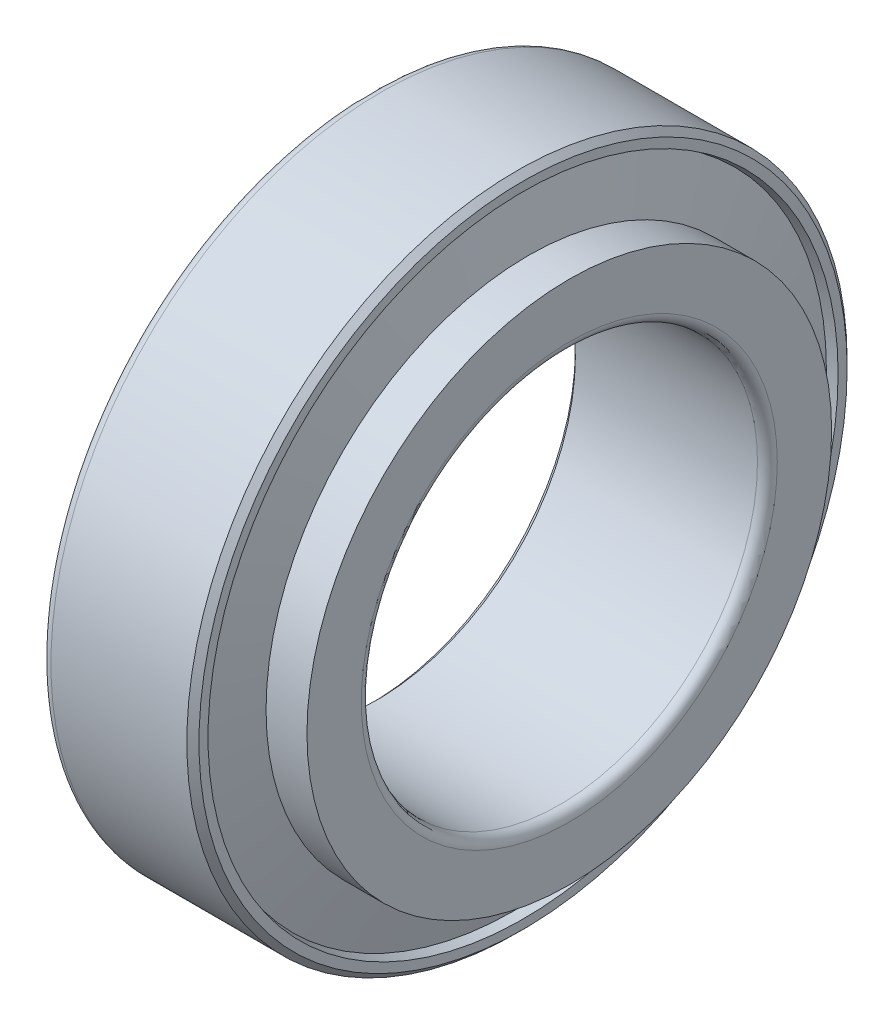
ISO-10303-21;
HEADER;
FILE_DESCRIPTION(('STEP AP214'),'2;1');
FILE_NAME('part.step','',(''),(''),'','','');
FILE_SCHEMA(('AUTOMOTIVE_DESIGN { 1 0 10303 214 1 1 1 1 }'));
ENDSEC;
DATA;
#1=APPLICATION_CONTEXT('core data for automotive mechanical design processes');
#2=APPLICATION_PROTOCOL_DEFINITION('international standard','automotive_design',2000,#1);
#3=PRODUCT_CONTEXT('',#1,'mechanical');
#4=PRODUCT('Part','Part','',(#3));
#5=PRODUCT_RELATED_PRODUCT_CATEGORY('part','',(#4));
#6=PRODUCT_DEFINITION_FORMATION('','',#4);
#7=PRODUCT_DEFINITION_CONTEXT('part definition',#1,'design');
#8=PRODUCT_DEFINITION('design','',#6,#7);
#9=PRODUCT_DEFINITION_SHAPE('','',#8);
#10=(LENGTH_UNIT() NAMED_UNIT(*) SI_UNIT(.MILLI.,.METRE.));
#11=(NAMED_UNIT(*) PLANE_ANGLE_UNIT() SI_UNIT($,.RADIAN.));
#12=(NAMED_UNIT(*) SI_UNIT($,.STERADIAN.) SOLID_ANGLE_UNIT());
#13=UNCERTAINTY_MEASURE_WITH_UNIT(LENGTH_MEASURE(1.E-05),#10,'distance_accuracy_value','');
#14=(GEOMETRIC_REPRESENTATION_CONTEXT(3) GLOBAL_UNCERTAINTY_ASSIGNED_CONTEXT((#13)) GLOBAL_UNIT_ASSIGNED_CONTEXT((#10,
#11,#12)) REPRESENTATION_CONTEXT('',''));
#15=CARTESIAN_POINT('',(0.,0.,0.));
#16=DIRECTION('',(0.,0.,1.));
#17=DIRECTION('',(1.,0.,0.));
#18=AXIS2_PLACEMENT_3D('',#15,#16,#17);
#19=CARTESIAN_POINT('',(-30.,0.,0.));
#20=DIRECTION('',(1.,0.,0.));
#21=DIRECTION('',(0.,0.,-1.));
#22=AXIS2_PLACEMENT_3D('',#19,#20,#21);
#23=CONICAL_SURFACE('',#22,41.7615,0.253072741539172);
#24=CARTESIAN_POINT('',(-28.4489138816247,0.,0.));
#25=DIRECTION('',(-1.,0.,0.));
#26=DIRECTION('',(0.,0.,1.));
#27=AXIS2_PLACEMENT_3D('',#24,#25,#26);
#28=CIRCLE('',#27,42.1626381450622);
#29=CARTESIAN_POINT('',(-28.4489138816247,0.,42.1626381450622));
#30=VERTEX_POINT('',#29);
#31=EDGE_CURVE('E41',#30,#30,#28,.T.);
#32=ORIENTED_EDGE('',*,*,#31,.F.);
#33=EDGE_LOOP('',(#32));
#34=FACE_BOUND('',#33,.T.);
#35=CARTESIAN_POINT('',(-30.,0.,0.));
#36=DIRECTION('',(1.,0.,0.));
#37=DIRECTION('',(0.,0.,-1.));
#38=AXIS2_PLACEMENT_3D('',#35,#36,#37);
#39=CIRCLE('',#38,41.7615);
#40=CARTESIAN_POINT('',(-30.,0.,-41.7615));
#41=VERTEX_POINT('',#40);
#42=EDGE_CURVE('E53',#41,#41,#39,.T.);
#43=ORIENTED_EDGE('',*,*,#42,.F.);
#44=EDGE_LOOP('',(#43));
#45=FACE_BOUND('',#44,.T.);
#46=ADVANCED_FACE('F30',(#34,#45),#23,.F.);
#47=CARTESIAN_POINT('',(-7.,49.08,0.));
#48=DIRECTION('',(1.,0.,0.));
#49=DIRECTION('',(0.,0.,-1.));
#50=AXIS2_PLACEMENT_3D('',#47,#48,#49);
#51=PLANE('',#50);
#52=CARTESIAN_POINT('',(-7.,0.,0.));
#53=DIRECTION('',(1.,0.,0.));
#54=DIRECTION('',(0.,0.,-1.));
#55=AXIS2_PLACEMENT_3D('',#52,#53,#54);
#56=CIRCLE('',#55,49.08);
#57=CARTESIAN_POINT('',(-7.,0.,-49.08));
#58=VERTEX_POINT('',#57);
#59=EDGE_CURVE('E65',#58,#58,#56,.T.);
#60=ORIENTED_EDGE('',*,*,#59,.T.);
#61=EDGE_LOOP('',(#60));
#62=FACE_BOUND('',#61,.T.);
#63=CARTESIAN_POINT('',(-7.,0.,0.));
#64=DIRECTION('',(1.,0.,0.));
#65=DIRECTION('',(0.,0.,-1.));
#66=AXIS2_PLACEMENT_3D('',#63,#64,#65);
#67=CIRCLE('',#66,47.7097044401853);
#68=CARTESIAN_POINT('',(-7.,0.,-47.7097044401853));
#69=VERTEX_POINT('',#68);
#70=EDGE_CURVE('E50',#69,#69,#67,.T.);
#71=ORIENTED_EDGE('',*,*,#70,.F.);
#72=EDGE_LOOP('',(#71));
#73=FACE_BOUND('',#72,.T.);
#74=ADVANCED_FACE('F32',(#62,#73),#51,.T.);
#75=CARTESIAN_POINT('',(-8.40825772579787,0.,0.));
#76=DIRECTION('',(-1.,0.,0.));
#77=DIRECTION('',(0.,0.,1.));
#78=AXIS2_PLACEMENT_3D('',#75,#76,#77);
#79=CIRCLE('',#78,47.345504228989);
#80=CARTESIAN_POINT('',(-8.40825772579787,0.,47.345504228989));
#81=VERTEX_POINT('',#80);
#82=EDGE_CURVE('E45',#81,#81,#79,.F.);
#83=ORIENTED_EDGE('',*,*,#82,.F.);
#84=EDGE_LOOP('',(#83));
#85=FACE_BOUND('',#84,.T.);
#86=ORIENTED_EDGE('',*,*,#70,.T.);
#87=EDGE_LOOP('',(#86));
#88=FACE_BOUND('',#87,.T.);
#89=ADVANCED_FACE('F118',(#85,#88),#23,.F.);
#90=CARTESIAN_POINT('',(-30.,41.7615,0.));
#91=DIRECTION('',(-1.,0.,0.));
#92=DIRECTION('',(0.,0.,1.));
#93=AXIS2_PLACEMENT_3D('',#90,#91,#92);
#94=PLANE('',#93);
#95=ORIENTED_EDGE('',*,*,#42,.T.);
#96=EDGE_LOOP('',(#95));
#97=FACE_BOUND('',#96,.T.);
#98=CARTESIAN_POINT('',(-30.,0.,0.));
#99=DIRECTION('',(1.,0.,0.));
#100=DIRECTION('',(0.,0.,-1.));
#101=AXIS2_PLACEMENT_3D('',#98,#99,#100);
#102=CIRCLE('',#101,48.5);
#103=CARTESIAN_POINT('',(-30.,0.,-48.5));
#104=VERTEX_POINT('',#103);
#105=EDGE_CURVE('E56',#104,#104,#102,.T.);
#106=ORIENTED_EDGE('',*,*,#105,.F.);
#107=EDGE_LOOP('',(#106));
#108=FACE_BOUND('',#107,.T.);
#109=ADVANCED_FACE('F127',(#97,#108),#94,.T.);
#110=CARTESIAN_POINT('',(-28.5,0.,0.));
#111=DIRECTION('',(1.,0.,0.));
#112=DIRECTION('',(0.,0.,-1.));
#113=AXIS2_PLACEMENT_3D('',#110,#111,#112);
#114=TOROIDAL_SURFACE('',#113,48.5,1.5);
#115=ORIENTED_EDGE('',*,*,#105,.T.);
#116=EDGE_LOOP('',(#115));
#117=FACE_BOUND('',#116,.T.);
#118=CARTESIAN_POINT('',(-28.5,0.,0.));
#119=DIRECTION('',(1.,0.,0.));
#120=DIRECTION('',(0.,0.,-1.));
#121=AXIS2_PLACEMENT_3D('',#118,#119,#120);
#122=CIRCLE('',#121,50.);
#123=CARTESIAN_POINT('',(-28.5,0.,-50.));
#124=VERTEX_POINT('',#123);
#125=EDGE_CURVE('E59',#124,#124,#122,.T.);
#126=ORIENTED_EDGE('',*,*,#125,.F.);
#127=EDGE_LOOP('',(#126));
#128=FACE_BOUND('',#127,.T.);
#129=ADVANCED_FACE('F132',(#117,#128),#114,.T.);
#130=CARTESIAN_POINT('',(-42.5,0.,0.));
#131=DIRECTION('',(1.,0.,0.));
#132=DIRECTION('',(0.,0.,-1.));
#133=AXIS2_PLACEMENT_3D('',#130,#131,#132);
#134=CYLINDRICAL_SURFACE('',#133,50.);
#135=ORIENTED_EDGE('',*,*,#125,.T.);
#136=EDGE_LOOP('',(#135));
#137=FACE_BOUND('',#136,.T.);
#138=CARTESIAN_POINT('',(-7.92,0.,0.));
#139=DIRECTION('',(1.,0.,0.));
#140=DIRECTION('',(0.,0.,-1.));
#141=AXIS2_PLACEMENT_3D('',#138,#139,#140);
#142=CIRCLE('',#141,50.);
#143=CARTESIAN_POINT('',(-7.92,0.,-50.));
#144=VERTEX_POINT('',#143);
#145=EDGE_CURVE('E62',#144,#144,#142,.T.);
#146=ORIENTED_EDGE('',*,*,#145,.F.);
#147=EDGE_LOOP('',(#146));
#148=FACE_BOUND('',#147,.T.);
#149=ADVANCED_FACE('F154',(#137,#148),#134,.T.);
#150=CARTESIAN_POINT('',(-7.,0.,0.));
#151=DIRECTION('',(-1.,0.,0.));
#152=DIRECTION('',(0.,0.,1.));
#153=AXIS2_PLACEMENT_3D('',#150,#151,#152);
#154=CONICAL_SURFACE('',#153,49.08,0.785398163397445);
#155=ORIENTED_EDGE('',*,*,#145,.T.);
#156=EDGE_LOOP('',(#155));
#157=FACE_BOUND('',#156,.T.);
#158=ORIENTED_EDGE('',*,*,#59,.F.);
#159=EDGE_LOOP('',(#158));
#160=FACE_BOUND('',#159,.T.);
#161=ADVANCED_FACE('F148',(#157,#160),#154,.T.);
#162=CARTESIAN_POINT('',(-28.5,0.,0.));
#163=DIRECTION('',(-1.,0.,0.));
#164=DIRECTION('',(0.,0.,1.));
#165=AXIS2_PLACEMENT_3D('',#162,#163,#164);
#166=CONICAL_SURFACE('',#165,42.3601735079514,1.31772358525572);
#167=CARTESIAN_POINT('',(-26.3629578763017,0.,0.));
#168=DIRECTION('',(-1.,0.,0.));
#169=DIRECTION('',(0.,0.,1.));
#170=AXIS2_PLACEMENT_3D('',#167,#168,#169);
#171=CIRCLE('',#170,34.0968447438968);
#172=CARTESIAN_POINT('',(-26.3629578763017,0.,34.0968447438968));
#173=VERTEX_POINT('',#172);
#174=EDGE_CURVE('E10',#173,#173,#171,.T.);
#175=ORIENTED_EDGE('',*,*,#174,.F.);
#176=EDGE_LOOP('',(#175));
#177=FACE_BOUND('',#176,.T.);
#178=ORIENTED_EDGE('',*,*,#31,.T.);
#179=EDGE_LOOP('',(#178));
#180=FACE_BOUND('',#179,.T.);
#181=ADVANCED_FACE('F142',(#177,#180),#166,.F.);
#182=CARTESIAN_POINT('',(-26.2465799635101,0.,0.));
#183=DIRECTION('',(1.,0.,0.));
#184=DIRECTION('',(0.,0.,-1.));
#185=AXIS2_PLACEMENT_3D('',#182,#183,#184);
#186=CONICAL_SURFACE('',#185,33.6468447445484,0.253072741539171);
#187=CARTESIAN_POINT('',(-26.2360192020194,0.,0.));
#188=DIRECTION('',(-1.,0.,0.));
#189=DIRECTION('',(0.,0.,1.));
#190=AXIS2_PLACEMENT_3D('',#187,#188,#189);
#191=CIRCLE('',#190,33.6495759431741);
#192=CARTESIAN_POINT('',(-26.2360192020194,0.,33.6495759431741));
#193=VERTEX_POINT('',#192);
#194=EDGE_CURVE('E37',#193,#193,#191,.F.);
#195=ORIENTED_EDGE('',*,*,#194,.F.);
#196=EDGE_LOOP('',(#195));
#197=FACE_BOUND('',#196,.T.);
#198=CARTESIAN_POINT('',(-6.20592380768323,0.,0.));
#199=DIRECTION('',(1.,0.,0.));
#200=DIRECTION('',(0.,0.,-1.));
#201=AXIS2_PLACEMENT_3D('',#198,#199,#200);
#202=CIRCLE('',#201,38.8297108284752);
#203=CARTESIAN_POINT('',(-6.20592380768323,0.,-38.8297108284752));
#204=VERTEX_POINT('',#203);
#205=EDGE_CURVE('E68',#204,#204,#202,.T.);
#206=ORIENTED_EDGE('',*,*,#205,.T.);
#207=EDGE_LOOP('',(#206));
#208=FACE_BOUND('',#207,.T.);
#209=ADVANCED_FACE('F113',(#197,#208),#186,.F.);
#210=CARTESIAN_POINT('',(-6.20592380768323,0.,0.));
#211=DIRECTION('',(-1.,0.,0.));
#212=DIRECTION('',(0.,0.,1.));
#213=AXIS2_PLACEMENT_3D('',#210,#211,#212);
#214=CONICAL_SURFACE('',#213,38.8297108284752,1.31772358525573);
#215=ORIENTED_EDGE('',*,*,#82,.T.);
#216=EDGE_LOOP('',(#215));
#217=FACE_BOUND('',#216,.T.);
#218=ORIENTED_EDGE('',*,*,#205,.F.);
#219=EDGE_LOOP('',(#218));
#220=FACE_BOUND('',#219,.T.);
#221=ADVANCED_FACE('F105',(#217,#220),#214,.T.);
#222=CARTESIAN_POINT('',(-26.2353128658599,0.,0.));
#223=DIRECTION('',(-1.,0.,0.));
#224=DIRECTION('',(0.,0.,1.));
#225=AXIS2_PLACEMENT_3D('',#222,#223,#224);
#226=CONICAL_SURFACE('',#225,33.6468447438968,1.31772358525572);
#227=ORIENTED_EDGE('',*,*,#194,.T.);
#228=EDGE_LOOP('',(#227));
#229=FACE_BOUND('',#228,.T.);
#230=CARTESIAN_POINT('',(-26.2353128658599,0.,0.));
#231=DIRECTION('',(1.,0.,0.));
#232=DIRECTION('',(0.,0.,-1.));
#233=AXIS2_PLACEMENT_3D('',#230,#231,#232);
#234=CIRCLE('',#233,33.6468447438968);
#235=CARTESIAN_POINT('',(-26.2353128658599,0.,-33.6468447438968));
#236=VERTEX_POINT('',#235);
#237=EDGE_CURVE('E95',#236,#236,#234,.T.);
#238=ORIENTED_EDGE('',*,*,#237,.F.);
#239=EDGE_LOOP('',(#238));
#240=FACE_BOUND('',#239,.T.);
#241=ADVANCED_FACE('F102',(#229,#240),#226,.T.);
#242=CARTESIAN_POINT('',(-42.5,0.,0.));
#243=DIRECTION('',(1.,0.,0.));
#244=DIRECTION('',(0.,0.,-1.));
#245=AXIS2_PLACEMENT_3D('',#242,#243,#244);
#246=CYLINDRICAL_SURFACE('',#245,34.0968447438968);
#247=ORIENTED_EDGE('',*,*,#174,.T.);
#248=EDGE_LOOP('',(#247));
#249=FACE_BOUND('',#248,.T.);
#250=CARTESIAN_POINT('',(-30.,0.,0.));
#251=DIRECTION('',(1.,0.,0.));
#252=DIRECTION('',(0.,0.,-1.));
#253=AXIS2_PLACEMENT_3D('',#250,#251,#252);
#254=CIRCLE('',#253,34.0968447438968);
#255=CARTESIAN_POINT('',(-30.,0.,-34.0968447438968));
#256=VERTEX_POINT('',#255);
#257=EDGE_CURVE('E71',#256,#256,#254,.T.);
#258=ORIENTED_EDGE('',*,*,#257,.T.);
#259=EDGE_LOOP('',(#258));
#260=FACE_BOUND('',#259,.T.);
#261=ADVANCED_FACE('F104',(#249,#260),#246,.T.);
#262=CARTESIAN_POINT('',(-30.,34.0968447438968,0.));
#263=DIRECTION('',(-1.,0.,0.));
#264=DIRECTION('',(0.,0.,1.));
#265=AXIS2_PLACEMENT_3D('',#262,#263,#264);
#266=PLANE('',#265);
#267=CARTESIAN_POINT('',(-30.,0.,0.));
#268=DIRECTION('',(1.,0.,0.));
#269=DIRECTION('',(0.,0.,-1.));
#270=AXIS2_PLACEMENT_3D('',#267,#268,#269);
#271=CIRCLE('',#270,30.92);
#272=CARTESIAN_POINT('',(-30.,0.,-30.92));
#273=VERTEX_POINT('',#272);
#274=EDGE_CURVE('E74',#273,#273,#271,.T.);
#275=ORIENTED_EDGE('',*,*,#274,.T.);
#276=EDGE_LOOP('',(#275));
#277=FACE_BOUND('',#276,.T.);
#278=ORIENTED_EDGE('',*,*,#257,.F.);
#279=EDGE_LOOP('',(#278));
#280=FACE_BOUND('',#279,.T.);
#281=ADVANCED_FACE('F111',(#277,#280),#266,.T.);
#282=CARTESIAN_POINT('',(-30.,0.,0.));
#283=DIRECTION('',(-1.,0.,0.));
#284=DIRECTION('',(0.,0.,1.));
#285=AXIS2_PLACEMENT_3D('',#282,#283,#284);
#286=CONICAL_SURFACE('',#285,30.92,0.785398163397448);
#287=CARTESIAN_POINT('',(-29.08,0.,0.));
#288=DIRECTION('',(1.,0.,0.));
#289=DIRECTION('',(0.,0.,-1.));
#290=AXIS2_PLACEMENT_3D('',#287,#288,#289);
#291=CIRCLE('',#290,30.);
#292=CARTESIAN_POINT('',(-29.08,0.,-30.));
#293=VERTEX_POINT('',#292);
#294=EDGE_CURVE('E77',#293,#293,#291,.T.);
#295=ORIENTED_EDGE('',*,*,#294,.T.);
#296=EDGE_LOOP('',(#295));
#297=FACE_BOUND('',#296,.T.);
#298=ORIENTED_EDGE('',*,*,#274,.F.);
#299=EDGE_LOOP('',(#298));
#300=FACE_BOUND('',#299,.T.);
#301=ADVANCED_FACE('F212',(#297,#300),#286,.F.);
#302=CARTESIAN_POINT('',(-42.5,0.,0.));
#303=DIRECTION('',(1.,0.,0.));
#304=DIRECTION('',(0.,0.,-1.));
#305=AXIS2_PLACEMENT_3D('',#302,#303,#304);
#306=CYLINDRICAL_SURFACE('',#305,30.);
#307=CARTESIAN_POINT('',(-1.5,0.,0.));
#308=DIRECTION('',(1.,0.,0.));
#309=DIRECTION('',(0.,0.,-1.));
#310=AXIS2_PLACEMENT_3D('',#307,#308,#309);
#311=CIRCLE('',#310,30.);
#312=CARTESIAN_POINT('',(-1.5,0.,-30.));
#313=VERTEX_POINT('',#312);
#314=EDGE_CURVE('E80',#313,#313,#311,.T.);
#315=ORIENTED_EDGE('',*,*,#314,.T.);
#316=EDGE_LOOP('',(#315));
#317=FACE_BOUND('',#316,.T.);
#318=ORIENTED_EDGE('',*,*,#294,.F.);
#319=EDGE_LOOP('',(#318));
#320=FACE_BOUND('',#319,.T.);
#321=ADVANCED_FACE('F222',(#317,#320),#306,.F.);
#322=CARTESIAN_POINT('',(-1.5,0.,0.));
#323=DIRECTION('',(1.,0.,0.));
#324=DIRECTION('',(0.,0.,-1.));
#325=AXIS2_PLACEMENT_3D('',#322,#323,#324);
#326=TOROIDAL_SURFACE('',#325,31.5,1.5);
#327=CARTESIAN_POINT('',(0.,0.,0.));
#328=DIRECTION('',(1.,0.,0.));
#329=DIRECTION('',(0.,0.,-1.));
#330=AXIS2_PLACEMENT_3D('',#327,#328,#329);
#331=CIRCLE('',#330,31.5);
#332=CARTESIAN_POINT('',(0.,0.,-31.5));
#333=VERTEX_POINT('',#332);
#334=EDGE_CURVE('E83',#333,#333,#331,.T.);
#335=ORIENTED_EDGE('',*,*,#334,.T.);
#336=EDGE_LOOP('',(#335));
#337=FACE_BOUND('',#336,.T.);
#338=ORIENTED_EDGE('',*,*,#314,.F.);
#339=EDGE_LOOP('',(#338));
#340=FACE_BOUND('',#339,.T.);
#341=ADVANCED_FACE('F232',(#337,#340),#326,.T.);
#342=CARTESIAN_POINT('',(0.,31.5,0.));
#343=DIRECTION('',(1.,0.,0.));
#344=DIRECTION('',(0.,0.,-1.));
#345=AXIS2_PLACEMENT_3D('',#342,#343,#344);
#346=PLANE('',#345);
#347=CARTESIAN_POINT('',(0.,0.,0.));
#348=DIRECTION('',(1.,0.,0.));
#349=DIRECTION('',(0.,0.,-1.));
#350=AXIS2_PLACEMENT_3D('',#347,#348,#349);
#351=CIRCLE('',#350,39.7297108278236);
#352=CARTESIAN_POINT('',(0.,0.,-39.7297108278236));
#353=VERTEX_POINT('',#352);
#354=EDGE_CURVE('E86',#353,#353,#351,.T.);
#355=ORIENTED_EDGE('',*,*,#354,.T.);
#356=EDGE_LOOP('',(#355));
#357=FACE_BOUND('',#356,.T.);
#358=ORIENTED_EDGE('',*,*,#334,.F.);
#359=EDGE_LOOP('',(#358));
#360=FACE_BOUND('',#359,.T.);
#361=ADVANCED_FACE('F242',(#357,#360),#346,.T.);
#362=CARTESIAN_POINT('',(-42.5,0.,0.));
#363=DIRECTION('',(1.,0.,0.));
#364=DIRECTION('',(0.,0.,-1.));
#365=AXIS2_PLACEMENT_3D('',#362,#363,#364);
#366=CYLINDRICAL_SURFACE('',#365,39.7297108278236);
#367=CARTESIAN_POINT('',(-6.19465671003302,0.,0.));
#368=DIRECTION('',(1.,0.,0.));
#369=DIRECTION('',(0.,0.,-1.));
#370=AXIS2_PLACEMENT_3D('',#367,#368,#369);
#371=CIRCLE('',#370,39.7297108278236);
#372=CARTESIAN_POINT('',(-6.19465671003302,0.,-39.7297108278236));
#373=VERTEX_POINT('',#372);
#374=EDGE_CURVE('E89',#373,#373,#371,.T.);
#375=ORIENTED_EDGE('',*,*,#374,.T.);
#376=EDGE_LOOP('',(#375));
#377=FACE_BOUND('',#376,.T.);
#378=ORIENTED_EDGE('',*,*,#354,.F.);
#379=EDGE_LOOP('',(#378));
#380=FACE_BOUND('',#379,.T.);
#381=ADVANCED_FACE('F252',(#377,#380),#366,.T.);
#382=CARTESIAN_POINT('',(-6.19465671003301,39.7297108278236,0.));
#383=DIRECTION('',(-1.,0.,0.));
#384=DIRECTION('',(0.,0.,1.));
#385=AXIS2_PLACEMENT_3D('',#382,#383,#384);
#386=PLANE('',#385);
#387=CARTESIAN_POINT('',(-6.19465671003302,0.,0.));
#388=DIRECTION('',(1.,0.,0.));
#389=DIRECTION('',(0.,0.,-1.));
#390=AXIS2_PLACEMENT_3D('',#387,#388,#389);
#391=CIRCLE('',#390,38.8297108278236);
#392=CARTESIAN_POINT('',(-6.19465671003302,0.,-38.8297108278236));
#393=VERTEX_POINT('',#392);
#394=EDGE_CURVE('E92',#393,#393,#391,.T.);
#395=ORIENTED_EDGE('',*,*,#394,.T.);
#396=EDGE_LOOP('',(#395));
#397=FACE_BOUND('',#396,.T.);
#398=ORIENTED_EDGE('',*,*,#374,.F.);
#399=EDGE_LOOP('',(#398));
#400=FACE_BOUND('',#399,.T.);
#401=ADVANCED_FACE('F262',(#397,#400),#386,.T.);
#402=CARTESIAN_POINT('',(-6.19465671003302,0.,0.));
#403=DIRECTION('',(1.,0.,0.));
#404=DIRECTION('',(0.,0.,-1.));
#405=AXIS2_PLACEMENT_3D('',#402,#403,#404);
#406=CONICAL_SURFACE('',#405,38.8297108278236,0.253072741539172);
#407=ORIENTED_EDGE('',*,*,#237,.T.);
#408=EDGE_LOOP('',(#407));
#409=FACE_BOUND('',#408,.T.);
#410=ORIENTED_EDGE('',*,*,#394,.F.);
#411=EDGE_LOOP('',(#410));
#412=FACE_BOUND('',#411,.T.);
#413=ADVANCED_FACE('F99',(#409,#412),#406,.T.);
#414=CLOSED_SHELL('',(#46,#74,#89,#109,#129,#149,#161,#181,#209,#221,#241,#261,#281,#301,#321,
#341,#361,#381,#401,#413));
#415=MANIFOLD_SOLID_BREP('B2',#414);
#416=ADVANCED_BREP_SHAPE_REPRESENTATION('',(#18,#415),#14);
#417=SHAPE_DEFINITION_REPRESENTATION(#9,#416);
ENDSEC;
END-ISO-10303-21;
